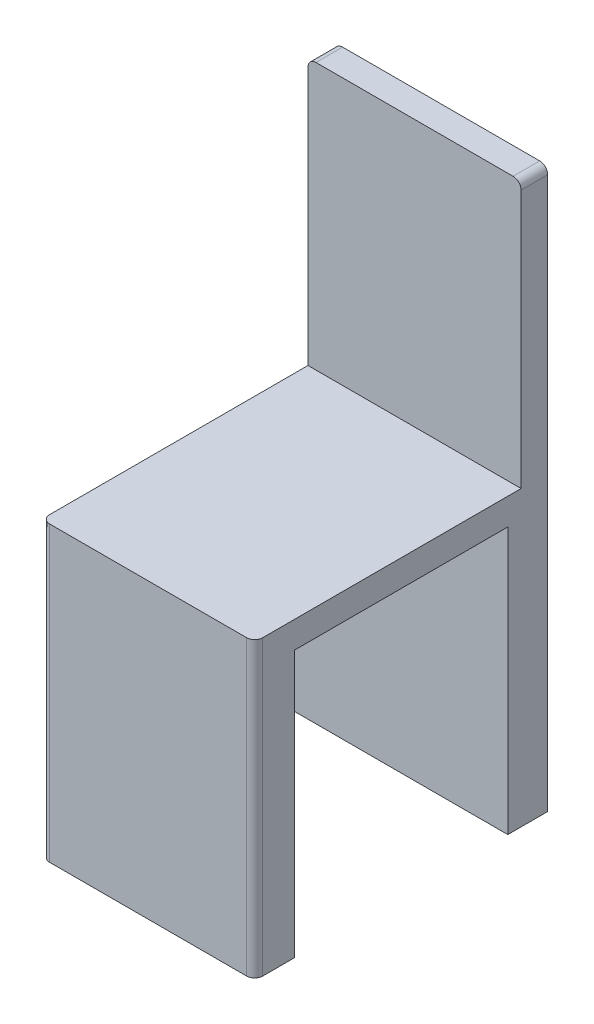
ISO-10303-21;
HEADER;
FILE_DESCRIPTION(('STEP AP214'),'2;1');
FILE_NAME('part.step','',(''),(''),'','','');
FILE_SCHEMA(('AUTOMOTIVE_DESIGN { 1 0 10303 214 1 1 1 1 }'));
ENDSEC;
DATA;
#1=APPLICATION_CONTEXT('core data for automotive mechanical design processes');
#2=APPLICATION_PROTOCOL_DEFINITION('international standard','automotive_design',2000,#1);
#3=PRODUCT_CONTEXT('',#1,'mechanical');
#4=PRODUCT('Part','Part','',(#3));
#5=PRODUCT_RELATED_PRODUCT_CATEGORY('part','',(#4));
#6=PRODUCT_DEFINITION_FORMATION('','',#4);
#7=PRODUCT_DEFINITION_CONTEXT('part definition',#1,'design');
#8=PRODUCT_DEFINITION('design','',#6,#7);
#9=PRODUCT_DEFINITION_SHAPE('','',#8);
#10=(LENGTH_UNIT() NAMED_UNIT(*) SI_UNIT(.MILLI.,.METRE.));
#11=(NAMED_UNIT(*) PLANE_ANGLE_UNIT() SI_UNIT($,.RADIAN.));
#12=(NAMED_UNIT(*) SI_UNIT($,.STERADIAN.) SOLID_ANGLE_UNIT());
#13=UNCERTAINTY_MEASURE_WITH_UNIT(LENGTH_MEASURE(1.E-05),#10,'distance_accuracy_value','');
#14=(GEOMETRIC_REPRESENTATION_CONTEXT(3) GLOBAL_UNCERTAINTY_ASSIGNED_CONTEXT((#13)) GLOBAL_UNIT_ASSIGNED_CONTEXT((#10,
#11,#12)) REPRESENTATION_CONTEXT('',''));
#15=CARTESIAN_POINT('',(0.,0.,0.));
#16=DIRECTION('',(0.,0.,1.));
#17=DIRECTION('',(1.,0.,0.));
#18=AXIS2_PLACEMENT_3D('',#15,#16,#17);
#19=CARTESIAN_POINT('',(80.,0.,0.));
#20=DIRECTION('',(0.,0.,1.));
#21=DIRECTION('',(0.,-1.,0.));
#22=AXIS2_PLACEMENT_3D('',#19,#20,#21);
#23=PLANE('',#22);
#24=DIRECTION('',(-1.,0.,0.));
#25=VECTOR('',#24,1.);
#26=CARTESIAN_POINT('',(80.,0.,0.));
#27=LINE('',#26,#25);
#28=CARTESIAN_POINT('',(77.,0.,0.));
#29=VERTEX_POINT('',#28);
#30=CARTESIAN_POINT('',(3.,0.,0.));
#31=VERTEX_POINT('',#30);
#32=EDGE_CURVE('E190',#29,#31,#27,.T.);
#33=ORIENTED_EDGE('',*,*,#32,.T.);
#34=DIRECTION('',(0.,1.,0.));
#35=VECTOR('',#34,1.);
#36=CARTESIAN_POINT('',(3.,-110.,0.));
#37=LINE('',#36,#35);
#38=CARTESIAN_POINT('',(3.,-110.,0.));
#39=VERTEX_POINT('',#38);
#40=EDGE_CURVE('E63',#31,#39,#37,.F.);
#41=ORIENTED_EDGE('',*,*,#40,.T.);
#42=DIRECTION('',(-1.,0.,0.));
#43=VECTOR('',#42,1.);
#44=CARTESIAN_POINT('',(80.,-110.,0.));
#45=LINE('',#44,#43);
#46=CARTESIAN_POINT('',(77.,-110.,0.));
#47=VERTEX_POINT('',#46);
#48=EDGE_CURVE('E163',#47,#39,#45,.T.);
#49=ORIENTED_EDGE('',*,*,#48,.F.);
#50=DIRECTION('',(0.,1.,0.));
#51=VECTOR('',#50,1.);
#52=CARTESIAN_POINT('',(77.,0.,0.));
#53=LINE('',#52,#51);
#54=EDGE_CURVE('E281',#47,#29,#53,.T.);
#55=ORIENTED_EDGE('',*,*,#54,.T.);
#56=EDGE_LOOP('',(#33,#41,#49,#55));
#57=FACE_BOUND('',#56,.T.);
#58=ADVANCED_FACE('F41',(#57),#23,.T.);
#59=CARTESIAN_POINT('',(80.,-110.,0.));
#60=DIRECTION('',(0.,1.,0.));
#61=DIRECTION('',(0.,0.,1.));
#62=AXIS2_PLACEMENT_3D('',#59,#60,#61);
#63=PLANE('',#62);
#64=ORIENTED_EDGE('',*,*,#48,.T.);
#65=CARTESIAN_POINT('',(3.,-110.,-3.));
#66=DIRECTION('',(0.,1.,0.));
#67=DIRECTION('',(0.,0.,1.));
#68=AXIS2_PLACEMENT_3D('',#65,#66,#67);
#69=CIRCLE('',#68,3.);
#70=CARTESIAN_POINT('',(0.,-110.,-3.));
#71=VERTEX_POINT('',#70);
#72=EDGE_CURVE('E50',#39,#71,#69,.F.);
#73=ORIENTED_EDGE('',*,*,#72,.T.);
#74=DIRECTION('',(0.,0.,-1.));
#75=VECTOR('',#74,1.);
#76=CARTESIAN_POINT('',(0.,-110.,0.));
#77=LINE('',#76,#75);
#78=CARTESIAN_POINT('',(0.,-110.,-15.));
#79=VERTEX_POINT('',#78);
#80=EDGE_CURVE('E158',#71,#79,#77,.T.);
#81=ORIENTED_EDGE('',*,*,#80,.T.);
#82=DIRECTION('',(-1.,0.,0.));
#83=VECTOR('',#82,1.);
#84=CARTESIAN_POINT('',(80.,-110.,-15.));
#85=LINE('',#84,#83);
#86=CARTESIAN_POINT('',(80.,-110.,-15.));
#87=VERTEX_POINT('',#86);
#88=EDGE_CURVE('E155',#87,#79,#85,.T.);
#89=ORIENTED_EDGE('',*,*,#88,.F.);
#90=DIRECTION('',(0.,0.,-1.));
#91=VECTOR('',#90,1.);
#92=CARTESIAN_POINT('',(80.,-110.,0.));
#93=LINE('',#92,#91);
#94=CARTESIAN_POINT('',(80.,-110.,-3.));
#95=VERTEX_POINT('',#94);
#96=EDGE_CURVE('E142',#95,#87,#93,.T.);
#97=ORIENTED_EDGE('',*,*,#96,.F.);
#98=CARTESIAN_POINT('',(77.,-110.,-3.));
#99=DIRECTION('',(0.,1.,0.));
#100=DIRECTION('',(0.,0.,1.));
#101=AXIS2_PLACEMENT_3D('',#98,#99,#100);
#102=CIRCLE('',#101,3.);
#103=EDGE_CURVE('E287',#95,#47,#102,.F.);
#104=ORIENTED_EDGE('',*,*,#103,.T.);
#105=EDGE_LOOP('',(#64,#73,#81,#89,#97,#104));
#106=FACE_BOUND('',#105,.T.);
#107=ADVANCED_FACE('F156',(#106),#63,.F.);
#108=CARTESIAN_POINT('',(80.,0.,-15.));
#109=DIRECTION('',(0.,0.,-1.));
#110=DIRECTION('',(0.,1.,0.));
#111=AXIS2_PLACEMENT_3D('',#108,#109,#110);
#112=PLANE('',#111);
#113=DIRECTION('',(0.,-1.,0.));
#114=VECTOR('',#113,1.);
#115=CARTESIAN_POINT('',(0.,0.,-15.));
#116=LINE('',#115,#114);
#117=CARTESIAN_POINT('',(0.,-10.,-15.));
#118=VERTEX_POINT('',#117);
#119=EDGE_CURVE('E193',#118,#79,#116,.T.);
#120=ORIENTED_EDGE('',*,*,#119,.F.);
#121=DIRECTION('',(-1.,0.,0.));
#122=VECTOR('',#121,1.);
#123=CARTESIAN_POINT('',(80.,-10.,-15.));
#124=LINE('',#123,#122);
#125=CARTESIAN_POINT('',(80.,-10.,-15.));
#126=VERTEX_POINT('',#125);
#127=EDGE_CURVE('E164',#126,#118,#124,.T.);
#128=ORIENTED_EDGE('',*,*,#127,.F.);
#129=DIRECTION('',(0.,-1.,0.));
#130=VECTOR('',#129,1.);
#131=CARTESIAN_POINT('',(80.,0.,-15.));
#132=LINE('',#131,#130);
#133=EDGE_CURVE('E147',#126,#87,#132,.T.);
#134=ORIENTED_EDGE('',*,*,#133,.T.);
#135=ORIENTED_EDGE('',*,*,#88,.T.);
#136=EDGE_LOOP('',(#120,#128,#134,#135));
#137=FACE_BOUND('',#136,.T.);
#138=ADVANCED_FACE('F166',(#137),#112,.T.);
#139=CARTESIAN_POINT('',(80.,-10.,0.));
#140=DIRECTION('',(0.,-1.,0.));
#141=DIRECTION('',(0.,0.,-1.));
#142=AXIS2_PLACEMENT_3D('',#139,#140,#141);
#143=PLANE('',#142);
#144=DIRECTION('',(0.,0.,1.));
#145=VECTOR('',#144,1.);
#146=CARTESIAN_POINT('',(0.,-10.,0.));
#147=LINE('',#146,#145);
#148=CARTESIAN_POINT('',(0.,-10.,-95.));
#149=VERTEX_POINT('',#148);
#150=EDGE_CURVE('E196',#149,#118,#147,.T.);
#151=ORIENTED_EDGE('',*,*,#150,.F.);
#152=DIRECTION('',(-1.,0.,0.));
#153=VECTOR('',#152,1.);
#154=CARTESIAN_POINT('',(80.,-10.,-95.));
#155=LINE('',#154,#153);
#156=CARTESIAN_POINT('',(80.,-10.,-95.));
#157=VERTEX_POINT('',#156);
#158=EDGE_CURVE('E238',#157,#149,#155,.T.);
#159=ORIENTED_EDGE('',*,*,#158,.F.);
#160=DIRECTION('',(0.,0.,1.));
#161=VECTOR('',#160,1.);
#162=CARTESIAN_POINT('',(80.,-10.,0.));
#163=LINE('',#162,#161);
#164=EDGE_CURVE('E168',#157,#126,#163,.T.);
#165=ORIENTED_EDGE('',*,*,#164,.T.);
#166=ORIENTED_EDGE('',*,*,#127,.T.);
#167=EDGE_LOOP('',(#151,#159,#165,#166));
#168=FACE_BOUND('',#167,.T.);
#169=ADVANCED_FACE('F337',(#168),#143,.T.);
#170=CARTESIAN_POINT('',(80.,0.,-95.));
#171=DIRECTION('',(0.,0.,-1.));
#172=DIRECTION('',(0.,1.,0.));
#173=AXIS2_PLACEMENT_3D('',#170,#171,#172);
#174=PLANE('',#173);
#175=DIRECTION('',(0.,-1.,0.));
#176=VECTOR('',#175,1.);
#177=CARTESIAN_POINT('',(0.,0.,-95.));
#178=LINE('',#177,#176);
#179=CARTESIAN_POINT('',(0.,-110.,-95.));
#180=VERTEX_POINT('',#179);
#181=EDGE_CURVE('E200',#149,#180,#178,.T.);
#182=ORIENTED_EDGE('',*,*,#181,.T.);
#183=DIRECTION('',(-1.,0.,0.));
#184=VECTOR('',#183,1.);
#185=CARTESIAN_POINT('',(80.,-110.,-95.));
#186=LINE('',#185,#184);
#187=CARTESIAN_POINT('',(80.,-110.,-95.));
#188=VERTEX_POINT('',#187);
#189=EDGE_CURVE('E235',#188,#180,#186,.T.);
#190=ORIENTED_EDGE('',*,*,#189,.F.);
#191=DIRECTION('',(0.,-1.,0.));
#192=VECTOR('',#191,1.);
#193=CARTESIAN_POINT('',(80.,0.,-95.));
#194=LINE('',#193,#192);
#195=EDGE_CURVE('E171',#157,#188,#194,.T.);
#196=ORIENTED_EDGE('',*,*,#195,.F.);
#197=ORIENTED_EDGE('',*,*,#158,.T.);
#198=EDGE_LOOP('',(#182,#190,#196,#197));
#199=FACE_BOUND('',#198,.T.);
#200=ADVANCED_FACE('F334',(#199),#174,.F.);
#201=CARTESIAN_POINT('',(80.,-110.,0.));
#202=DIRECTION('',(0.,-1.,0.));
#203=DIRECTION('',(0.,0.,-1.));
#204=AXIS2_PLACEMENT_3D('',#201,#202,#203);
#205=PLANE('',#204);
#206=DIRECTION('',(0.,0.,1.));
#207=VECTOR('',#206,1.);
#208=CARTESIAN_POINT('',(0.,-110.,0.));
#209=LINE('',#208,#207);
#210=CARTESIAN_POINT('',(0.,-110.,-110.));
#211=VERTEX_POINT('',#210);
#212=EDGE_CURVE('E204',#211,#180,#209,.T.);
#213=ORIENTED_EDGE('',*,*,#212,.F.);
#214=DIRECTION('',(-1.,0.,0.));
#215=VECTOR('',#214,1.);
#216=CARTESIAN_POINT('',(80.,-110.,-110.));
#217=LINE('',#216,#215);
#218=CARTESIAN_POINT('',(80.,-110.,-110.));
#219=VERTEX_POINT('',#218);
#220=EDGE_CURVE('E231',#219,#211,#217,.T.);
#221=ORIENTED_EDGE('',*,*,#220,.F.);
#222=DIRECTION('',(0.,0.,1.));
#223=VECTOR('',#222,1.);
#224=CARTESIAN_POINT('',(80.,-110.,0.));
#225=LINE('',#224,#223);
#226=EDGE_CURVE('E176',#219,#188,#225,.T.);
#227=ORIENTED_EDGE('',*,*,#226,.T.);
#228=ORIENTED_EDGE('',*,*,#189,.T.);
#229=EDGE_LOOP('',(#213,#221,#227,#228));
#230=FACE_BOUND('',#229,.T.);
#231=ADVANCED_FACE('F330',(#230),#205,.T.);
#232=CARTESIAN_POINT('',(80.,0.,-110.));
#233=DIRECTION('',(0.,0.,-1.));
#234=DIRECTION('',(0.,1.,0.));
#235=AXIS2_PLACEMENT_3D('',#232,#233,#234);
#236=PLANE('',#235);
#237=DIRECTION('',(0.,-1.,0.));
#238=VECTOR('',#237,1.);
#239=CARTESIAN_POINT('',(0.,0.,-110.));
#240=LINE('',#239,#238);
#241=CARTESIAN_POINT('',(0.,97.,-110.));
#242=VERTEX_POINT('',#241);
#243=EDGE_CURVE('E208',#242,#211,#240,.T.);
#244=ORIENTED_EDGE('',*,*,#243,.F.);
#245=CARTESIAN_POINT('',(3.,97.,-110.));
#246=DIRECTION('',(0.,0.,-1.));
#247=DIRECTION('',(0.,1.,0.));
#248=AXIS2_PLACEMENT_3D('',#245,#246,#247);
#249=CIRCLE('',#248,3.);
#250=CARTESIAN_POINT('',(3.,100.,-110.));
#251=VERTEX_POINT('',#250);
#252=EDGE_CURVE('E252',#242,#251,#249,.T.);
#253=ORIENTED_EDGE('',*,*,#252,.T.);
#254=DIRECTION('',(-1.,0.,0.));
#255=VECTOR('',#254,1.);
#256=CARTESIAN_POINT('',(80.,100.,-110.));
#257=LINE('',#256,#255);
#258=CARTESIAN_POINT('',(77.,100.,-110.));
#259=VERTEX_POINT('',#258);
#260=EDGE_CURVE('E227',#259,#251,#257,.T.);
#261=ORIENTED_EDGE('',*,*,#260,.F.);
#262=CARTESIAN_POINT('',(77.,97.,-110.));
#263=DIRECTION('',(0.,0.,-1.));
#264=DIRECTION('',(0.,1.,0.));
#265=AXIS2_PLACEMENT_3D('',#262,#263,#264);
#266=CIRCLE('',#265,3.);
#267=CARTESIAN_POINT('',(80.,97.,-110.));
#268=VERTEX_POINT('',#267);
#269=EDGE_CURVE('E249',#259,#268,#266,.T.);
#270=ORIENTED_EDGE('',*,*,#269,.T.);
#271=DIRECTION('',(0.,-1.,0.));
#272=VECTOR('',#271,1.);
#273=CARTESIAN_POINT('',(80.,0.,-110.));
#274=LINE('',#273,#272);
#275=EDGE_CURVE('E180',#268,#219,#274,.T.);
#276=ORIENTED_EDGE('',*,*,#275,.T.);
#277=ORIENTED_EDGE('',*,*,#220,.T.);
#278=EDGE_LOOP('',(#244,#253,#261,#270,#276,#277));
#279=FACE_BOUND('',#278,.T.);
#280=ADVANCED_FACE('F320',(#279),#236,.T.);
#281=CARTESIAN_POINT('',(80.,100.,0.));
#282=DIRECTION('',(0.,1.,0.));
#283=DIRECTION('',(0.,0.,1.));
#284=AXIS2_PLACEMENT_3D('',#281,#282,#283);
#285=PLANE('',#284);
#286=ORIENTED_EDGE('',*,*,#260,.T.);
#287=DIRECTION('',(0.,0.,-1.));
#288=VECTOR('',#287,1.);
#289=CARTESIAN_POINT('',(3.,100.,-100.));
#290=LINE('',#289,#288);
#291=CARTESIAN_POINT('',(3.,100.,-100.));
#292=VERTEX_POINT('',#291);
#293=EDGE_CURVE('E259',#251,#292,#290,.F.);
#294=ORIENTED_EDGE('',*,*,#293,.T.);
#295=DIRECTION('',(-1.,0.,0.));
#296=VECTOR('',#295,1.);
#297=CARTESIAN_POINT('',(80.,100.,-100.));
#298=LINE('',#297,#296);
#299=CARTESIAN_POINT('',(77.,100.,-100.));
#300=VERTEX_POINT('',#299);
#301=EDGE_CURVE('E223',#300,#292,#298,.T.);
#302=ORIENTED_EDGE('',*,*,#301,.F.);
#303=DIRECTION('',(0.,0.,-1.));
#304=VECTOR('',#303,1.);
#305=CARTESIAN_POINT('',(77.,100.,0.));
#306=LINE('',#305,#304);
#307=EDGE_CURVE('E255',#300,#259,#306,.T.);
#308=ORIENTED_EDGE('',*,*,#307,.T.);
#309=EDGE_LOOP('',(#286,#294,#302,#308));
#310=FACE_BOUND('',#309,.T.);
#311=ADVANCED_FACE('F316',(#310),#285,.T.);
#312=CARTESIAN_POINT('',(80.,0.,-100.));
#313=DIRECTION('',(0.,0.,1.));
#314=DIRECTION('',(1.,0.,0.));
#315=AXIS2_PLACEMENT_3D('',#312,#313,#314);
#316=PLANE('',#315);
#317=ORIENTED_EDGE('',*,*,#301,.T.);
#318=CARTESIAN_POINT('',(3.,97.,-100.));
#319=DIRECTION('',(0.,0.,1.));
#320=DIRECTION('',(1.,0.,0.));
#321=AXIS2_PLACEMENT_3D('',#318,#319,#320);
#322=CIRCLE('',#321,3.);
#323=CARTESIAN_POINT('',(0.,97.,-100.));
#324=VERTEX_POINT('',#323);
#325=EDGE_CURVE('E265',#292,#324,#322,.T.);
#326=ORIENTED_EDGE('',*,*,#325,.T.);
#327=DIRECTION('',(0.,1.,0.));
#328=VECTOR('',#327,1.);
#329=CARTESIAN_POINT('',(0.,0.,-100.));
#330=LINE('',#329,#328);
#331=CARTESIAN_POINT('',(0.,0.,-100.));
#332=VERTEX_POINT('',#331);
#333=EDGE_CURVE('E211',#332,#324,#330,.T.);
#334=ORIENTED_EDGE('',*,*,#333,.F.);
#335=DIRECTION('',(-1.,0.,0.));
#336=VECTOR('',#335,1.);
#337=CARTESIAN_POINT('',(80.,0.,-100.));
#338=LINE('',#337,#336);
#339=CARTESIAN_POINT('',(80.,0.,-100.));
#340=VERTEX_POINT('',#339);
#341=EDGE_CURVE('E219',#340,#332,#338,.T.);
#342=ORIENTED_EDGE('',*,*,#341,.F.);
#343=DIRECTION('',(0.,1.,0.));
#344=VECTOR('',#343,1.);
#345=CARTESIAN_POINT('',(80.,0.,-100.));
#346=LINE('',#345,#344);
#347=CARTESIAN_POINT('',(80.,97.,-100.));
#348=VERTEX_POINT('',#347);
#349=EDGE_CURVE('E183',#340,#348,#346,.T.);
#350=ORIENTED_EDGE('',*,*,#349,.T.);
#351=CARTESIAN_POINT('',(77.,97.,-100.));
#352=DIRECTION('',(0.,0.,1.));
#353=DIRECTION('',(1.,0.,0.));
#354=AXIS2_PLACEMENT_3D('',#351,#352,#353);
#355=CIRCLE('',#354,3.);
#356=EDGE_CURVE('E262',#348,#300,#355,.T.);
#357=ORIENTED_EDGE('',*,*,#356,.T.);
#358=EDGE_LOOP('',(#317,#326,#334,#342,#350,#357));
#359=FACE_BOUND('',#358,.T.);
#360=ADVANCED_FACE('F308',(#359),#316,.T.);
#361=CARTESIAN_POINT('',(80.,0.,0.));
#362=DIRECTION('',(0.,1.,0.));
#363=DIRECTION('',(0.,0.,1.));
#364=AXIS2_PLACEMENT_3D('',#361,#362,#363);
#365=PLANE('',#364);
#366=DIRECTION('',(0.,0.,-1.));
#367=VECTOR('',#366,1.);
#368=CARTESIAN_POINT('',(0.,0.,0.));
#369=LINE('',#368,#367);
#370=CARTESIAN_POINT('',(0.,0.,-3.));
#371=VERTEX_POINT('',#370);
#372=EDGE_CURVE('E152',#371,#332,#369,.T.);
#373=ORIENTED_EDGE('',*,*,#372,.F.);
#374=CARTESIAN_POINT('',(3.,0.,-3.));
#375=DIRECTION('',(0.,1.,0.));
#376=DIRECTION('',(0.,0.,1.));
#377=AXIS2_PLACEMENT_3D('',#374,#375,#376);
#378=CIRCLE('',#377,3.);
#379=EDGE_CURVE('E278',#371,#31,#378,.T.);
#380=ORIENTED_EDGE('',*,*,#379,.T.);
#381=ORIENTED_EDGE('',*,*,#32,.F.);
#382=CARTESIAN_POINT('',(77.,0.,-3.));
#383=DIRECTION('',(0.,1.,0.));
#384=DIRECTION('',(0.,0.,1.));
#385=AXIS2_PLACEMENT_3D('',#382,#383,#384);
#386=CIRCLE('',#385,3.);
#387=CARTESIAN_POINT('',(80.,0.,-3.));
#388=VERTEX_POINT('',#387);
#389=EDGE_CURVE('E275',#29,#388,#386,.T.);
#390=ORIENTED_EDGE('',*,*,#389,.T.);
#391=DIRECTION('',(0.,0.,-1.));
#392=VECTOR('',#391,1.);
#393=CARTESIAN_POINT('',(80.,0.,0.));
#394=LINE('',#393,#392);
#395=EDGE_CURVE('E187',#388,#340,#394,.T.);
#396=ORIENTED_EDGE('',*,*,#395,.T.);
#397=ORIENTED_EDGE('',*,*,#341,.T.);
#398=EDGE_LOOP('',(#373,#380,#381,#390,#396,#397));
#399=FACE_BOUND('',#398,.T.);
#400=ADVANCED_FACE('F299',(#399),#365,.T.);
#401=CARTESIAN_POINT('',(80.,0.,0.));
#402=DIRECTION('',(1.,0.,0.));
#403=DIRECTION('',(0.,0.,-1.));
#404=AXIS2_PLACEMENT_3D('',#401,#402,#403);
#405=PLANE('',#404);
#406=ORIENTED_EDGE('',*,*,#395,.F.);
#407=DIRECTION('',(0.,1.,0.));
#408=VECTOR('',#407,1.);
#409=CARTESIAN_POINT('',(80.,0.,-3.));
#410=LINE('',#409,#408);
#411=EDGE_CURVE('E11',#388,#95,#410,.F.);
#412=ORIENTED_EDGE('',*,*,#411,.T.);
#413=ORIENTED_EDGE('',*,*,#96,.T.);
#414=ORIENTED_EDGE('',*,*,#133,.F.);
#415=ORIENTED_EDGE('',*,*,#164,.F.);
#416=ORIENTED_EDGE('',*,*,#195,.T.);
#417=ORIENTED_EDGE('',*,*,#226,.F.);
#418=ORIENTED_EDGE('',*,*,#275,.F.);
#419=DIRECTION('',(0.,0.,-1.));
#420=VECTOR('',#419,1.);
#421=CARTESIAN_POINT('',(80.,97.,0.));
#422=LINE('',#421,#420);
#423=EDGE_CURVE('E268',#268,#348,#422,.F.);
#424=ORIENTED_EDGE('',*,*,#423,.T.);
#425=ORIENTED_EDGE('',*,*,#349,.F.);
#426=EDGE_LOOP('',(#406,#412,#413,#414,#415,#416,#417,#418,#424,#425));
#427=FACE_BOUND('',#426,.T.);
#428=ADVANCED_FACE('F144',(#427),#405,.T.);
#429=CARTESIAN_POINT('',(0.,0.,0.));
#430=DIRECTION('',(1.,0.,0.));
#431=DIRECTION('',(0.,0.,-1.));
#432=AXIS2_PLACEMENT_3D('',#429,#430,#431);
#433=PLANE('',#432);
#434=ORIENTED_EDGE('',*,*,#80,.F.);
#435=DIRECTION('',(0.,1.,0.));
#436=VECTOR('',#435,1.);
#437=CARTESIAN_POINT('',(0.,0.,-3.));
#438=LINE('',#437,#436);
#439=EDGE_CURVE('E271',#71,#371,#438,.T.);
#440=ORIENTED_EDGE('',*,*,#439,.T.);
#441=ORIENTED_EDGE('',*,*,#372,.T.);
#442=ORIENTED_EDGE('',*,*,#333,.T.);
#443=DIRECTION('',(0.,0.,-1.));
#444=VECTOR('',#443,1.);
#445=CARTESIAN_POINT('',(0.,97.,-110.));
#446=LINE('',#445,#444);
#447=EDGE_CURVE('E245',#324,#242,#446,.T.);
#448=ORIENTED_EDGE('',*,*,#447,.T.);
#449=ORIENTED_EDGE('',*,*,#243,.T.);
#450=ORIENTED_EDGE('',*,*,#212,.T.);
#451=ORIENTED_EDGE('',*,*,#181,.F.);
#452=ORIENTED_EDGE('',*,*,#150,.T.);
#453=ORIENTED_EDGE('',*,*,#119,.T.);
#454=EDGE_LOOP('',(#434,#440,#441,#442,#448,#449,#450,#451,#452,#453));
#455=FACE_BOUND('',#454,.T.);
#456=ADVANCED_FACE('F294',(#455),#433,.F.);
#457=CARTESIAN_POINT('',(3.,97.,0.));
#458=DIRECTION('',(0.,0.,1.));
#459=DIRECTION('',(1.,0.,0.));
#460=AXIS2_PLACEMENT_3D('',#457,#458,#459);
#461=CYLINDRICAL_SURFACE('',#460,3.);
#462=ORIENTED_EDGE('',*,*,#325,.F.);
#463=ORIENTED_EDGE('',*,*,#293,.F.);
#464=ORIENTED_EDGE('',*,*,#252,.F.);
#465=ORIENTED_EDGE('',*,*,#447,.F.);
#466=EDGE_LOOP('',(#462,#463,#464,#465));
#467=FACE_BOUND('',#466,.T.);
#468=ADVANCED_FACE('F324',(#467),#461,.T.);
#469=CARTESIAN_POINT('',(77.,97.,0.));
#470=DIRECTION('',(0.,0.,-1.));
#471=DIRECTION('',(-1.,0.,0.));
#472=AXIS2_PLACEMENT_3D('',#469,#470,#471);
#473=CYLINDRICAL_SURFACE('',#472,3.);
#474=ORIENTED_EDGE('',*,*,#356,.F.);
#475=ORIENTED_EDGE('',*,*,#423,.F.);
#476=ORIENTED_EDGE('',*,*,#269,.F.);
#477=ORIENTED_EDGE('',*,*,#307,.F.);
#478=EDGE_LOOP('',(#474,#475,#476,#477));
#479=FACE_BOUND('',#478,.T.);
#480=ADVANCED_FACE('F313',(#479),#473,.T.);
#481=CARTESIAN_POINT('',(3.,0.,-3.));
#482=DIRECTION('',(0.,-1.,0.));
#483=DIRECTION('',(0.,0.,-1.));
#484=AXIS2_PLACEMENT_3D('',#481,#482,#483);
#485=CYLINDRICAL_SURFACE('',#484,3.);
#486=ORIENTED_EDGE('',*,*,#72,.F.);
#487=ORIENTED_EDGE('',*,*,#40,.F.);
#488=ORIENTED_EDGE('',*,*,#379,.F.);
#489=ORIENTED_EDGE('',*,*,#439,.F.);
#490=EDGE_LOOP('',(#486,#487,#488,#489));
#491=FACE_BOUND('',#490,.T.);
#492=ADVANCED_FACE('F296',(#491),#485,.T.);
#493=CARTESIAN_POINT('',(77.,0.,-3.));
#494=DIRECTION('',(0.,1.,0.));
#495=DIRECTION('',(0.,0.,1.));
#496=AXIS2_PLACEMENT_3D('',#493,#494,#495);
#497=CYLINDRICAL_SURFACE('',#496,3.);
#498=ORIENTED_EDGE('',*,*,#103,.F.);
#499=ORIENTED_EDGE('',*,*,#411,.F.);
#500=ORIENTED_EDGE('',*,*,#389,.F.);
#501=ORIENTED_EDGE('',*,*,#54,.F.);
#502=EDGE_LOOP('',(#498,#499,#500,#501));
#503=FACE_BOUND('',#502,.T.);
#504=ADVANCED_FACE('F43',(#503),#497,.T.);
#505=CLOSED_SHELL('',(#58,#107,#138,#169,#200,#231,#280,#311,#360,#400,#428,#456,#468,#480,#492,#504));
#506=MANIFOLD_SOLID_BREP('B2',#505);
#507=ADVANCED_BREP_SHAPE_REPRESENTATION('',(#18,#506),#14);
#508=SHAPE_DEFINITION_REPRESENTATION(#9,#507);
ENDSEC;
END-ISO-10303-21;
